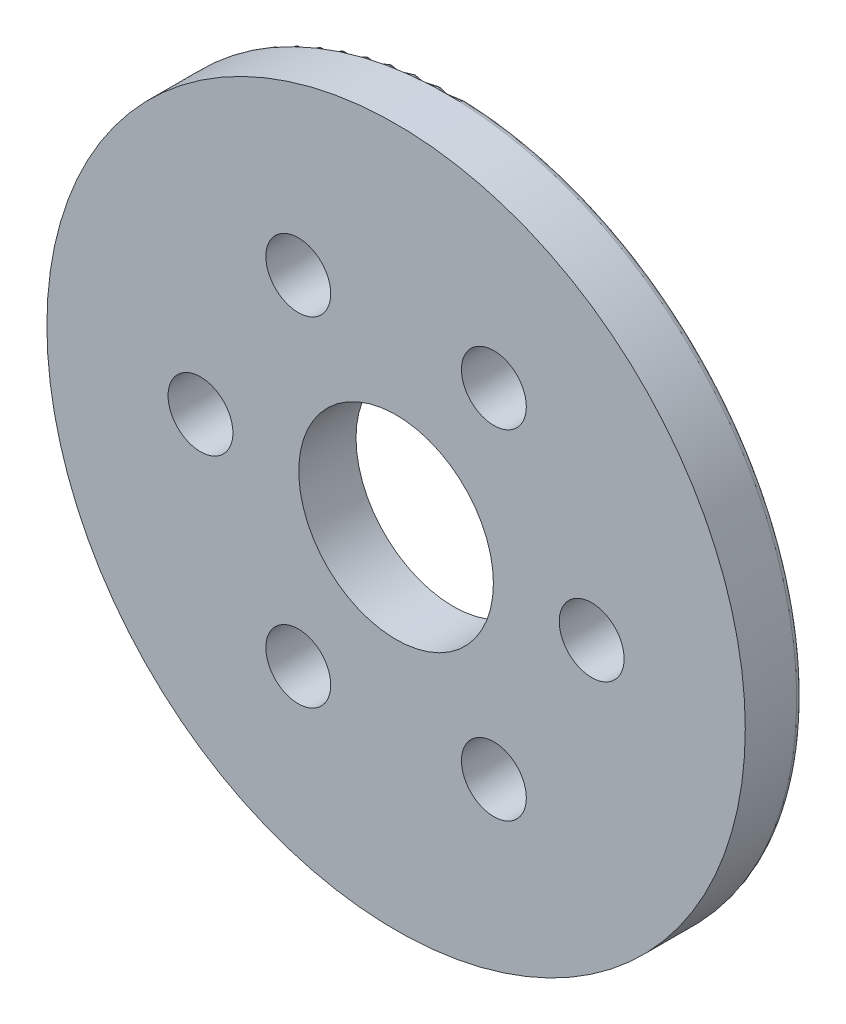
ISO-10303-21;
HEADER;
FILE_DESCRIPTION(('STEP AP214'),'2;1');
FILE_NAME('part.step','',(''),(''),'','','');
FILE_SCHEMA(('AUTOMOTIVE_DESIGN { 1 0 10303 214 1 1 1 1 }'));
ENDSEC;
DATA;
#1=APPLICATION_CONTEXT('core data for automotive mechanical design processes');
#2=APPLICATION_PROTOCOL_DEFINITION('international standard','automotive_design',2000,#1);
#3=PRODUCT_CONTEXT('',#1,'mechanical');
#4=PRODUCT('Part','Part','',(#3));
#5=PRODUCT_RELATED_PRODUCT_CATEGORY('part','',(#4));
#6=PRODUCT_DEFINITION_FORMATION('','',#4);
#7=PRODUCT_DEFINITION_CONTEXT('part definition',#1,'design');
#8=PRODUCT_DEFINITION('design','',#6,#7);
#9=PRODUCT_DEFINITION_SHAPE('','',#8);
#10=(LENGTH_UNIT() NAMED_UNIT(*) SI_UNIT(.MILLI.,.METRE.));
#11=(NAMED_UNIT(*) PLANE_ANGLE_UNIT() SI_UNIT($,.RADIAN.));
#12=(NAMED_UNIT(*) SI_UNIT($,.STERADIAN.) SOLID_ANGLE_UNIT());
#13=UNCERTAINTY_MEASURE_WITH_UNIT(LENGTH_MEASURE(1.E-05),#10,'distance_accuracy_value','');
#14=(GEOMETRIC_REPRESENTATION_CONTEXT(3) GLOBAL_UNCERTAINTY_ASSIGNED_CONTEXT((#13)) GLOBAL_UNIT_ASSIGNED_CONTEXT((#10,
#11,#12)) REPRESENTATION_CONTEXT('',''));
#15=CARTESIAN_POINT('',(0.,0.,0.));
#16=DIRECTION('',(0.,0.,1.));
#17=DIRECTION('',(1.,0.,0.));
#18=AXIS2_PLACEMENT_3D('',#15,#16,#17);
#19=CARTESIAN_POINT('',(0.,36.,-153.4));
#20=DIRECTION('',(0.,0.,1.));
#21=DIRECTION('',(1.,0.,0.));
#22=AXIS2_PLACEMENT_3D('',#19,#20,#21);
#23=CYLINDRICAL_SURFACE('',#22,18.3);
#24=CARTESIAN_POINT('',(0.,36.,-153.0952));
#25=DIRECTION('',(0.,0.,-1.));
#26=DIRECTION('',(-1.,0.,0.));
#27=AXIS2_PLACEMENT_3D('',#24,#25,#26);
#28=CIRCLE('',#27,18.3);
#29=CARTESIAN_POINT('',(-18.3,36.,-153.0952));
#30=VERTEX_POINT('',#29);
#31=EDGE_CURVE('E12',#30,#30,#28,.F.);
#32=ORIENTED_EDGE('',*,*,#31,.T.);
#33=EDGE_LOOP('',(#32));
#34=FACE_BOUND('',#33,.T.);
#35=CARTESIAN_POINT('',(0.,36.,-150.4));
#36=DIRECTION('',(0.,0.,1.));
#37=DIRECTION('',(1.,0.,0.));
#38=AXIS2_PLACEMENT_3D('',#35,#36,#37);
#39=CIRCLE('',#38,18.3);
#40=CARTESIAN_POINT('',(18.3,36.,-150.4));
#41=VERTEX_POINT('',#40);
#42=EDGE_CURVE('E74',#41,#41,#39,.T.);
#43=ORIENTED_EDGE('',*,*,#42,.F.);
#44=EDGE_LOOP('',(#43));
#45=FACE_BOUND('',#44,.T.);
#46=ADVANCED_FACE('F55',(#34,#45),#23,.T.);
#47=CARTESIAN_POINT('',(0.,36.,-153.4));
#48=DIRECTION('',(0.,0.,1.));
#49=DIRECTION('',(1.,0.,0.));
#50=AXIS2_PLACEMENT_3D('',#47,#48,#49);
#51=CYLINDRICAL_SURFACE('',#50,5.1);
#52=CARTESIAN_POINT('',(0.,36.,-153.4));
#53=DIRECTION('',(0.,0.,-1.));
#54=DIRECTION('',(-1.,0.,0.));
#55=AXIS2_PLACEMENT_3D('',#52,#53,#54);
#56=CIRCLE('',#55,5.1);
#57=CARTESIAN_POINT('',(-5.1,36.,-153.4));
#58=VERTEX_POINT('',#57);
#59=EDGE_CURVE('E67',#58,#58,#56,.T.);
#60=ORIENTED_EDGE('',*,*,#59,.T.);
#61=EDGE_LOOP('',(#60));
#62=FACE_BOUND('',#61,.T.);
#63=CARTESIAN_POINT('',(0.,36.,-150.4));
#64=DIRECTION('',(0.,0.,1.));
#65=DIRECTION('',(1.,0.,0.));
#66=AXIS2_PLACEMENT_3D('',#63,#64,#65);
#67=CIRCLE('',#66,5.1);
#68=CARTESIAN_POINT('',(5.1,36.,-150.4));
#69=VERTEX_POINT('',#68);
#70=EDGE_CURVE('E93',#69,#69,#67,.T.);
#71=ORIENTED_EDGE('',*,*,#70,.T.);
#72=EDGE_LOOP('',(#71));
#73=FACE_BOUND('',#72,.T.);
#74=ADVANCED_FACE('F136',(#62,#73),#51,.F.);
#75=CARTESIAN_POINT('',(-10.25,36.,0.));
#76=DIRECTION('',(0.,0.,1.));
#77=DIRECTION('',(1.,0.,0.));
#78=AXIS2_PLACEMENT_3D('',#75,#76,#77);
#79=CYLINDRICAL_SURFACE('',#78,1.7);
#80=CARTESIAN_POINT('',(-10.25,36.,-153.4));
#81=DIRECTION('',(0.,0.,-1.));
#82=DIRECTION('',(-1.,0.,0.));
#83=AXIS2_PLACEMENT_3D('',#80,#81,#82);
#84=CIRCLE('',#83,1.7);
#85=CARTESIAN_POINT('',(-11.95,36.,-153.4));
#86=VERTEX_POINT('',#85);
#87=EDGE_CURVE('E86',#86,#86,#84,.T.);
#88=ORIENTED_EDGE('',*,*,#87,.T.);
#89=EDGE_LOOP('',(#88));
#90=FACE_BOUND('',#89,.T.);
#91=CARTESIAN_POINT('',(-10.25,36.,-150.4));
#92=DIRECTION('',(0.,0.,1.));
#93=DIRECTION('',(1.,0.,0.));
#94=AXIS2_PLACEMENT_3D('',#91,#92,#93);
#95=CIRCLE('',#94,1.7);
#96=CARTESIAN_POINT('',(-8.55,36.,-150.4));
#97=VERTEX_POINT('',#96);
#98=EDGE_CURVE('E96',#97,#97,#95,.F.);
#99=ORIENTED_EDGE('',*,*,#98,.F.);
#100=EDGE_LOOP('',(#99));
#101=FACE_BOUND('',#100,.T.);
#102=ADVANCED_FACE('F141',(#90,#101),#79,.F.);
#103=CARTESIAN_POINT('',(-5.12500000000001,27.1232396112095,0.));
#104=DIRECTION('',(0.,0.,1.));
#105=DIRECTION('',(1.,0.,0.));
#106=AXIS2_PLACEMENT_3D('',#103,#104,#105);
#107=CYLINDRICAL_SURFACE('',#106,1.7);
#108=CARTESIAN_POINT('',(-5.12500000000001,27.1232396112095,-153.4));
#109=DIRECTION('',(0.,0.,-1.));
#110=DIRECTION('',(-1.,0.,0.));
#111=AXIS2_PLACEMENT_3D('',#108,#109,#110);
#112=CIRCLE('',#111,1.7);
#113=CARTESIAN_POINT('',(-6.82500000000001,27.1232396112095,-153.4));
#114=VERTEX_POINT('',#113);
#115=EDGE_CURVE('E83',#114,#114,#112,.T.);
#116=ORIENTED_EDGE('',*,*,#115,.T.);
#117=EDGE_LOOP('',(#116));
#118=FACE_BOUND('',#117,.T.);
#119=CARTESIAN_POINT('',(-5.12500000000001,27.1232396112095,-150.4));
#120=DIRECTION('',(0.,0.,1.));
#121=DIRECTION('',(1.,0.,0.));
#122=AXIS2_PLACEMENT_3D('',#119,#120,#121);
#123=CIRCLE('',#122,1.7);
#124=CARTESIAN_POINT('',(-3.425,27.1232396112095,-150.4));
#125=VERTEX_POINT('',#124);
#126=EDGE_CURVE('E99',#125,#125,#123,.F.);
#127=ORIENTED_EDGE('',*,*,#126,.F.);
#128=EDGE_LOOP('',(#127));
#129=FACE_BOUND('',#128,.T.);
#130=ADVANCED_FACE('F148',(#118,#129),#107,.F.);
#131=CARTESIAN_POINT('',(5.125,27.1232396112095,0.));
#132=DIRECTION('',(0.,0.,1.));
#133=DIRECTION('',(1.,0.,0.));
#134=AXIS2_PLACEMENT_3D('',#131,#132,#133);
#135=CYLINDRICAL_SURFACE('',#134,1.7);
#136=CARTESIAN_POINT('',(5.125,27.1232396112095,-153.4));
#137=DIRECTION('',(0.,0.,-1.));
#138=DIRECTION('',(-1.,0.,0.));
#139=AXIS2_PLACEMENT_3D('',#136,#137,#138);
#140=CIRCLE('',#139,1.7);
#141=CARTESIAN_POINT('',(3.425,27.1232396112095,-153.4));
#142=VERTEX_POINT('',#141);
#143=EDGE_CURVE('E80',#142,#142,#140,.T.);
#144=ORIENTED_EDGE('',*,*,#143,.T.);
#145=EDGE_LOOP('',(#144));
#146=FACE_BOUND('',#145,.T.);
#147=CARTESIAN_POINT('',(5.125,27.1232396112095,-150.4));
#148=DIRECTION('',(0.,0.,1.));
#149=DIRECTION('',(1.,0.,0.));
#150=AXIS2_PLACEMENT_3D('',#147,#148,#149);
#151=CIRCLE('',#150,1.7);
#152=CARTESIAN_POINT('',(6.825,27.1232396112095,-150.4));
#153=VERTEX_POINT('',#152);
#154=EDGE_CURVE('E102',#153,#153,#151,.F.);
#155=ORIENTED_EDGE('',*,*,#154,.F.);
#156=EDGE_LOOP('',(#155));
#157=FACE_BOUND('',#156,.T.);
#158=ADVANCED_FACE('F152',(#146,#157),#135,.F.);
#159=CARTESIAN_POINT('',(10.25,36.,0.));
#160=DIRECTION('',(0.,0.,1.));
#161=DIRECTION('',(1.,0.,0.));
#162=AXIS2_PLACEMENT_3D('',#159,#160,#161);
#163=CYLINDRICAL_SURFACE('',#162,1.7);
#164=CARTESIAN_POINT('',(10.25,36.,-153.4));
#165=DIRECTION('',(0.,0.,-1.));
#166=DIRECTION('',(-1.,0.,0.));
#167=AXIS2_PLACEMENT_3D('',#164,#165,#166);
#168=CIRCLE('',#167,1.7);
#169=CARTESIAN_POINT('',(8.55,36.,-153.4));
#170=VERTEX_POINT('',#169);
#171=EDGE_CURVE('E77',#170,#170,#168,.T.);
#172=ORIENTED_EDGE('',*,*,#171,.T.);
#173=EDGE_LOOP('',(#172));
#174=FACE_BOUND('',#173,.T.);
#175=CARTESIAN_POINT('',(10.25,36.,-150.4));
#176=DIRECTION('',(0.,0.,1.));
#177=DIRECTION('',(1.,0.,0.));
#178=AXIS2_PLACEMENT_3D('',#175,#176,#177);
#179=CIRCLE('',#178,1.7);
#180=CARTESIAN_POINT('',(11.95,36.,-150.4));
#181=VERTEX_POINT('',#180);
#182=EDGE_CURVE('E105',#181,#181,#179,.F.);
#183=ORIENTED_EDGE('',*,*,#182,.F.);
#184=EDGE_LOOP('',(#183));
#185=FACE_BOUND('',#184,.T.);
#186=ADVANCED_FACE('F131',(#174,#185),#163,.F.);
#187=CARTESIAN_POINT('',(-5.125,44.8767603887905,0.));
#188=DIRECTION('',(0.,0.,1.));
#189=DIRECTION('',(1.,0.,0.));
#190=AXIS2_PLACEMENT_3D('',#187,#188,#189);
#191=CYLINDRICAL_SURFACE('',#190,1.7);
#192=CARTESIAN_POINT('',(-5.125,44.8767603887905,-153.4));
#193=DIRECTION('',(0.,0.,-1.));
#194=DIRECTION('',(-1.,0.,0.));
#195=AXIS2_PLACEMENT_3D('',#192,#193,#194);
#196=CIRCLE('',#195,1.7);
#197=CARTESIAN_POINT('',(-6.825,44.8767603887905,-153.4));
#198=VERTEX_POINT('',#197);
#199=EDGE_CURVE('E73',#198,#198,#196,.T.);
#200=ORIENTED_EDGE('',*,*,#199,.T.);
#201=EDGE_LOOP('',(#200));
#202=FACE_BOUND('',#201,.T.);
#203=CARTESIAN_POINT('',(-5.125,44.8767603887905,-150.4));
#204=DIRECTION('',(0.,0.,1.));
#205=DIRECTION('',(1.,0.,0.));
#206=AXIS2_PLACEMENT_3D('',#203,#204,#205);
#207=CIRCLE('',#206,1.7);
#208=CARTESIAN_POINT('',(-3.425,44.8767603887905,-150.4));
#209=VERTEX_POINT('',#208);
#210=EDGE_CURVE('E108',#209,#209,#207,.F.);
#211=ORIENTED_EDGE('',*,*,#210,.F.);
#212=EDGE_LOOP('',(#211));
#213=FACE_BOUND('',#212,.T.);
#214=ADVANCED_FACE('F121',(#202,#213),#191,.F.);
#215=CARTESIAN_POINT('',(5.12500000000001,44.8767603887905,0.));
#216=DIRECTION('',(0.,0.,1.));
#217=DIRECTION('',(1.,0.,0.));
#218=AXIS2_PLACEMENT_3D('',#215,#216,#217);
#219=CYLINDRICAL_SURFACE('',#218,1.7);
#220=CARTESIAN_POINT('',(5.12500000000001,44.8767603887905,-153.4));
#221=DIRECTION('',(0.,0.,-1.));
#222=DIRECTION('',(-1.,0.,0.));
#223=AXIS2_PLACEMENT_3D('',#220,#221,#222);
#224=CIRCLE('',#223,1.7);
#225=CARTESIAN_POINT('',(3.425,44.8767603887905,-153.4));
#226=VERTEX_POINT('',#225);
#227=EDGE_CURVE('E70',#226,#226,#224,.T.);
#228=ORIENTED_EDGE('',*,*,#227,.T.);
#229=EDGE_LOOP('',(#228));
#230=FACE_BOUND('',#229,.T.);
#231=CARTESIAN_POINT('',(5.12500000000001,44.8767603887905,-150.4));
#232=DIRECTION('',(0.,0.,1.));
#233=DIRECTION('',(1.,0.,0.));
#234=AXIS2_PLACEMENT_3D('',#231,#232,#233);
#235=CIRCLE('',#234,1.7);
#236=CARTESIAN_POINT('',(6.82500000000001,44.8767603887905,-150.4));
#237=VERTEX_POINT('',#236);
#238=EDGE_CURVE('E59',#237,#237,#235,.F.);
#239=ORIENTED_EDGE('',*,*,#238,.F.);
#240=EDGE_LOOP('',(#239));
#241=FACE_BOUND('',#240,.T.);
#242=ADVANCED_FACE('F118',(#230,#241),#219,.F.);
#243=CARTESIAN_POINT('',(0.,36.,-153.4));
#244=DIRECTION('',(0.,0.,-1.));
#245=DIRECTION('',(-1.,0.,0.));
#246=AXIS2_PLACEMENT_3D('',#243,#244,#245);
#247=PLANE('',#246);
#248=CARTESIAN_POINT('',(0.,36.,-153.4));
#249=DIRECTION('',(0.,0.,-1.));
#250=DIRECTION('',(-1.,0.,0.));
#251=AXIS2_PLACEMENT_3D('',#248,#249,#250);
#252=CIRCLE('',#251,17.9952);
#253=CARTESIAN_POINT('',(-17.9952,36.,-153.4));
#254=VERTEX_POINT('',#253);
#255=EDGE_CURVE('E63',#254,#254,#252,.T.);
#256=ORIENTED_EDGE('',*,*,#255,.T.);
#257=EDGE_LOOP('',(#256));
#258=FACE_BOUND('',#257,.T.);
#259=ORIENTED_EDGE('',*,*,#227,.F.);
#260=EDGE_LOOP('',(#259));
#261=FACE_BOUND('',#260,.T.);
#262=ORIENTED_EDGE('',*,*,#199,.F.);
#263=EDGE_LOOP('',(#262));
#264=FACE_BOUND('',#263,.T.);
#265=ORIENTED_EDGE('',*,*,#171,.F.);
#266=EDGE_LOOP('',(#265));
#267=FACE_BOUND('',#266,.T.);
#268=ORIENTED_EDGE('',*,*,#143,.F.);
#269=EDGE_LOOP('',(#268));
#270=FACE_BOUND('',#269,.T.);
#271=ORIENTED_EDGE('',*,*,#115,.F.);
#272=EDGE_LOOP('',(#271));
#273=FACE_BOUND('',#272,.T.);
#274=ORIENTED_EDGE('',*,*,#87,.F.);
#275=EDGE_LOOP('',(#274));
#276=FACE_BOUND('',#275,.T.);
#277=ORIENTED_EDGE('',*,*,#59,.F.);
#278=EDGE_LOOP('',(#277));
#279=FACE_BOUND('',#278,.T.);
#280=ADVANCED_FACE('F120',(#258,#261,#264,#267,#270,#273,#276,#279),#247,.T.);
#281=CARTESIAN_POINT('',(0.,36.,-153.0952));
#282=DIRECTION('',(0.,0.,-1.));
#283=DIRECTION('',(-1.,0.,0.));
#284=AXIS2_PLACEMENT_3D('',#281,#282,#283);
#285=TOROIDAL_SURFACE('',#284,17.9952,0.3048);
#286=ORIENTED_EDGE('',*,*,#31,.F.);
#287=EDGE_LOOP('',(#286));
#288=FACE_BOUND('',#287,.T.);
#289=ORIENTED_EDGE('',*,*,#255,.F.);
#290=EDGE_LOOP('',(#289));
#291=FACE_BOUND('',#290,.T.);
#292=ADVANCED_FACE('F57',(#288,#291),#285,.T.);
#293=CARTESIAN_POINT('',(0.,0.,-150.4));
#294=DIRECTION('',(0.,0.,1.));
#295=DIRECTION('',(1.,0.,0.));
#296=AXIS2_PLACEMENT_3D('',#293,#294,#295);
#297=PLANE('',#296);
#298=ORIENTED_EDGE('',*,*,#98,.T.);
#299=EDGE_LOOP('',(#298));
#300=FACE_BOUND('',#299,.T.);
#301=ORIENTED_EDGE('',*,*,#126,.T.);
#302=EDGE_LOOP('',(#301));
#303=FACE_BOUND('',#302,.T.);
#304=ORIENTED_EDGE('',*,*,#154,.T.);
#305=EDGE_LOOP('',(#304));
#306=FACE_BOUND('',#305,.T.);
#307=ORIENTED_EDGE('',*,*,#182,.T.);
#308=EDGE_LOOP('',(#307));
#309=FACE_BOUND('',#308,.T.);
#310=ORIENTED_EDGE('',*,*,#210,.T.);
#311=EDGE_LOOP('',(#310));
#312=FACE_BOUND('',#311,.T.);
#313=ORIENTED_EDGE('',*,*,#238,.T.);
#314=EDGE_LOOP('',(#313));
#315=FACE_BOUND('',#314,.T.);
#316=ORIENTED_EDGE('',*,*,#70,.F.);
#317=EDGE_LOOP('',(#316));
#318=FACE_BOUND('',#317,.T.);
#319=ORIENTED_EDGE('',*,*,#42,.T.);
#320=EDGE_LOOP('',(#319));
#321=FACE_BOUND('',#320,.T.);
#322=ADVANCED_FACE('F115',(#300,#303,#306,#309,#312,#315,#318,#321),#297,.T.);
#323=CLOSED_SHELL('',(#46,#74,#102,#130,#158,#186,#214,#242,#280,#292,#322));
#324=MANIFOLD_SOLID_BREP('B2',#323);
#325=ADVANCED_BREP_SHAPE_REPRESENTATION('',(#18,#324),#14);
#326=SHAPE_DEFINITION_REPRESENTATION(#9,#325);
ENDSEC;
END-ISO-10303-21;
